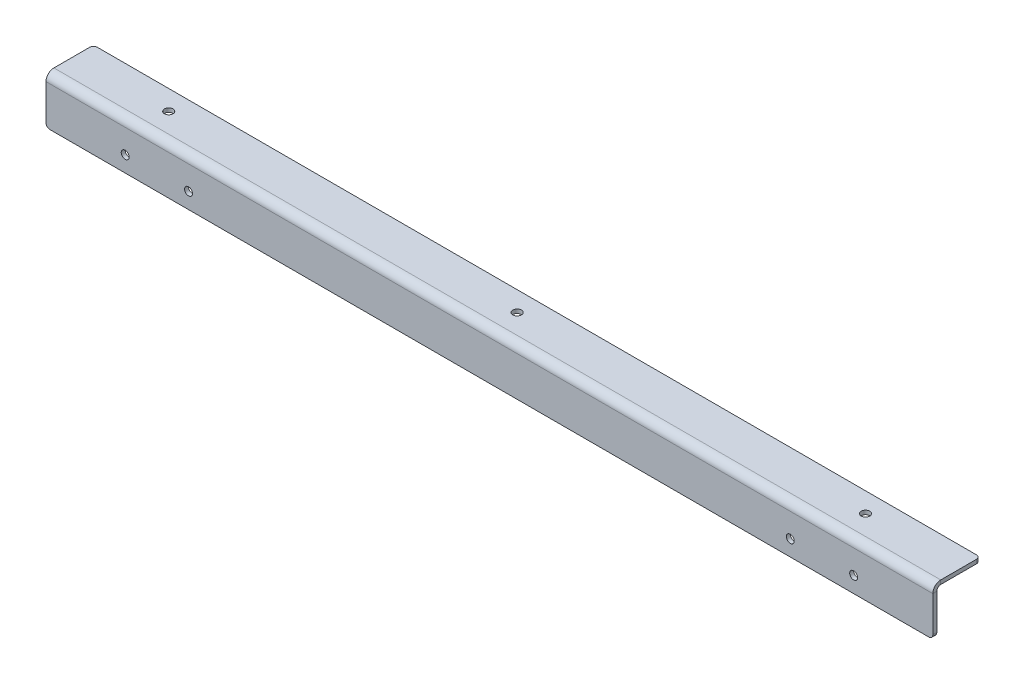
ISO-10303-21;
HEADER;
FILE_DESCRIPTION(('STEP AP214'),'2;1');
FILE_NAME('part.step','',(''),(''),'','','');
FILE_SCHEMA(('AUTOMOTIVE_DESIGN { 1 0 10303 214 1 1 1 1 }'));
ENDSEC;
DATA;
#1=APPLICATION_CONTEXT('core data for automotive mechanical design processes');
#2=APPLICATION_PROTOCOL_DEFINITION('international standard','automotive_design',2000,#1);
#3=PRODUCT_CONTEXT('',#1,'mechanical');
#4=PRODUCT('Part','Part','',(#3));
#5=PRODUCT_RELATED_PRODUCT_CATEGORY('part','',(#4));
#6=PRODUCT_DEFINITION_FORMATION('','',#4);
#7=PRODUCT_DEFINITION_CONTEXT('part definition',#1,'design');
#8=PRODUCT_DEFINITION('design','',#6,#7);
#9=PRODUCT_DEFINITION_SHAPE('','',#8);
#10=(LENGTH_UNIT() NAMED_UNIT(*) SI_UNIT(.MILLI.,.METRE.));
#11=(NAMED_UNIT(*) PLANE_ANGLE_UNIT() SI_UNIT($,.RADIAN.));
#12=(NAMED_UNIT(*) SI_UNIT($,.STERADIAN.) SOLID_ANGLE_UNIT());
#13=UNCERTAINTY_MEASURE_WITH_UNIT(LENGTH_MEASURE(1.E-05),#10,'distance_accuracy_value','');
#14=(GEOMETRIC_REPRESENTATION_CONTEXT(3) GLOBAL_UNCERTAINTY_ASSIGNED_CONTEXT((#13)) GLOBAL_UNIT_ASSIGNED_CONTEXT((#10,
#11,#12)) REPRESENTATION_CONTEXT('',''));
#15=CARTESIAN_POINT('',(0.,0.,0.));
#16=DIRECTION('',(0.,0.,1.));
#17=DIRECTION('',(1.,0.,0.));
#18=AXIS2_PLACEMENT_3D('',#15,#16,#17);
#19=CARTESIAN_POINT('',(711.2,38.1,-6.35));
#20=DIRECTION('',(1.,0.,0.));
#21=DIRECTION('',(0.,0.,-1.));
#22=AXIS2_PLACEMENT_3D('',#19,#20,#21);
#23=PLANE('',#22);
#24=DIRECTION('',(0.,-1.,0.));
#25=VECTOR('',#24,1.);
#26=CARTESIAN_POINT('',(711.2,38.1,-6.35));
#27=LINE('',#26,#25);
#28=CARTESIAN_POINT('',(711.2,38.1,-6.35));
#29=VERTEX_POINT('',#28);
#30=CARTESIAN_POINT('',(711.2,34.925,-6.35));
#31=VERTEX_POINT('',#30);
#32=EDGE_CURVE('E134',#29,#31,#27,.T.);
#33=ORIENTED_EDGE('',*,*,#32,.F.);
#34=CARTESIAN_POINT('',(711.2,31.75,-6.35));
#35=DIRECTION('',(1.,0.,0.));
#36=DIRECTION('',(0.,0.,-1.));
#37=AXIS2_PLACEMENT_3D('',#34,#35,#36);
#38=CIRCLE('',#37,6.35);
#39=CARTESIAN_POINT('',(711.2,31.75,0.));
#40=VERTEX_POINT('',#39);
#41=EDGE_CURVE('E138',#40,#29,#38,.F.);
#42=ORIENTED_EDGE('',*,*,#41,.F.);
#43=DIRECTION('',(0.,0.,1.));
#44=VECTOR('',#43,1.);
#45=CARTESIAN_POINT('',(711.2,31.75,-3.175));
#46=LINE('',#45,#44);
#47=CARTESIAN_POINT('',(711.2,31.75,-3.175));
#48=VERTEX_POINT('',#47);
#49=EDGE_CURVE('E147',#48,#40,#46,.T.);
#50=ORIENTED_EDGE('',*,*,#49,.F.);
#51=CARTESIAN_POINT('',(711.2,31.75,-6.35));
#52=DIRECTION('',(1.,0.,0.));
#53=DIRECTION('',(0.,0.,-1.));
#54=AXIS2_PLACEMENT_3D('',#51,#52,#53);
#55=CIRCLE('',#54,3.175);
#56=EDGE_CURVE('E140',#48,#31,#55,.F.);
#57=ORIENTED_EDGE('',*,*,#56,.T.);
#58=EDGE_LOOP('',(#33,#42,#50,#57));
#59=FACE_BOUND('',#58,.T.);
#60=ADVANCED_FACE('F42',(#59),#23,.T.);
#61=CARTESIAN_POINT('',(711.2,31.75,-3.175));
#62=DIRECTION('',(1.,0.,0.));
#63=DIRECTION('',(0.,0.,-1.));
#64=AXIS2_PLACEMENT_3D('',#61,#62,#63);
#65=PLANE('',#64);
#66=DIRECTION('',(0.,0.,-1.));
#67=VECTOR('',#66,1.);
#68=CARTESIAN_POINT('',(711.2,34.925,0.));
#69=LINE('',#68,#67);
#70=CARTESIAN_POINT('',(711.2,34.925,-34.925));
#71=VERTEX_POINT('',#70);
#72=EDGE_CURVE('E170',#31,#71,#69,.T.);
#73=ORIENTED_EDGE('',*,*,#72,.T.);
#74=DIRECTION('',(0.,-1.,0.));
#75=VECTOR('',#74,1.);
#76=CARTESIAN_POINT('',(711.2,31.75,-34.925));
#77=LINE('',#76,#75);
#78=CARTESIAN_POINT('',(711.2,38.1,-34.925));
#79=VERTEX_POINT('',#78);
#80=EDGE_CURVE('E168',#71,#79,#77,.F.);
#81=ORIENTED_EDGE('',*,*,#80,.T.);
#82=DIRECTION('',(0.,0.,-1.));
#83=VECTOR('',#82,1.);
#84=CARTESIAN_POINT('',(711.2,38.1,0.));
#85=LINE('',#84,#83);
#86=EDGE_CURVE('E155',#29,#79,#85,.T.);
#87=ORIENTED_EDGE('',*,*,#86,.F.);
#88=ORIENTED_EDGE('',*,*,#32,.T.);
#89=EDGE_LOOP('',(#73,#81,#87,#88));
#90=FACE_BOUND('',#89,.T.);
#91=ADVANCED_FACE('F166',(#90),#65,.T.);
#92=CARTESIAN_POINT('',(0.,31.75,0.));
#93=DIRECTION('',(-1.,0.,0.));
#94=DIRECTION('',(0.,0.,1.));
#95=AXIS2_PLACEMENT_3D('',#92,#93,#94);
#96=PLANE('',#95);
#97=DIRECTION('',(0.,0.,-1.));
#98=VECTOR('',#97,1.);
#99=CARTESIAN_POINT('',(0.,31.75,0.));
#100=LINE('',#99,#98);
#101=CARTESIAN_POINT('',(0.,31.75,0.));
#102=VERTEX_POINT('',#101);
#103=CARTESIAN_POINT('',(0.,31.75,-3.175));
#104=VERTEX_POINT('',#103);
#105=EDGE_CURVE('E235',#102,#104,#100,.T.);
#106=ORIENTED_EDGE('',*,*,#105,.F.);
#107=CARTESIAN_POINT('',(0.,31.75,-6.35));
#108=DIRECTION('',(1.,0.,0.));
#109=DIRECTION('',(0.,0.,-1.));
#110=AXIS2_PLACEMENT_3D('',#107,#108,#109);
#111=CIRCLE('',#110,6.35);
#112=CARTESIAN_POINT('',(0.,38.1,-6.35));
#113=VERTEX_POINT('',#112);
#114=EDGE_CURVE('E196',#102,#113,#111,.F.);
#115=ORIENTED_EDGE('',*,*,#114,.T.);
#116=DIRECTION('',(0.,1.,0.));
#117=VECTOR('',#116,1.);
#118=CARTESIAN_POINT('',(0.,34.925,-6.35));
#119=LINE('',#118,#117);
#120=CARTESIAN_POINT('',(0.,34.925,-6.35));
#121=VERTEX_POINT('',#120);
#122=EDGE_CURVE('E232',#121,#113,#119,.T.);
#123=ORIENTED_EDGE('',*,*,#122,.F.);
#124=CARTESIAN_POINT('',(0.,31.75,-6.35));
#125=DIRECTION('',(1.,0.,0.));
#126=DIRECTION('',(0.,0.,-1.));
#127=AXIS2_PLACEMENT_3D('',#124,#125,#126);
#128=CIRCLE('',#127,3.175);
#129=EDGE_CURVE('E205',#104,#121,#128,.F.);
#130=ORIENTED_EDGE('',*,*,#129,.F.);
#131=EDGE_LOOP('',(#106,#115,#123,#130));
#132=FACE_BOUND('',#131,.T.);
#133=ADVANCED_FACE('F300',(#132),#96,.T.);
#134=CARTESIAN_POINT('',(0.,34.925,-6.35));
#135=DIRECTION('',(-1.,0.,0.));
#136=DIRECTION('',(0.,0.,1.));
#137=AXIS2_PLACEMENT_3D('',#134,#135,#136);
#138=PLANE('',#137);
#139=DIRECTION('',(0.,1.,0.));
#140=VECTOR('',#139,1.);
#141=CARTESIAN_POINT('',(0.,0.,-3.175));
#142=LINE('',#141,#140);
#143=CARTESIAN_POINT('',(0.,3.175,-3.175));
#144=VERTEX_POINT('',#143);
#145=EDGE_CURVE('E202',#144,#104,#142,.T.);
#146=ORIENTED_EDGE('',*,*,#145,.F.);
#147=DIRECTION('',(0.,0.,1.));
#148=VECTOR('',#147,1.);
#149=CARTESIAN_POINT('',(0.,3.175,-6.35));
#150=LINE('',#149,#148);
#151=CARTESIAN_POINT('',(0.,3.175,0.));
#152=VERTEX_POINT('',#151);
#153=EDGE_CURVE('E11',#144,#152,#150,.T.);
#154=ORIENTED_EDGE('',*,*,#153,.T.);
#155=DIRECTION('',(0.,1.,0.));
#156=VECTOR('',#155,1.);
#157=CARTESIAN_POINT('',(0.,0.,0.));
#158=LINE('',#157,#156);
#159=EDGE_CURVE('E199',#152,#102,#158,.T.);
#160=ORIENTED_EDGE('',*,*,#159,.T.);
#161=ORIENTED_EDGE('',*,*,#105,.T.);
#162=EDGE_LOOP('',(#146,#154,#160,#161));
#163=FACE_BOUND('',#162,.T.);
#164=ADVANCED_FACE('F310',(#163),#138,.T.);
#165=CARTESIAN_POINT('',(711.2,34.925,0.));
#166=DIRECTION('',(0.,1.,0.));
#167=DIRECTION('',(0.,0.,1.));
#168=AXIS2_PLACEMENT_3D('',#165,#166,#167);
#169=PLANE('',#168);
#170=CARTESIAN_POINT('',(76.2,34.925,-22.225));
#171=DIRECTION('',(0.,1.,0.));
#172=DIRECTION('',(0.,0.,1.));
#173=AXIS2_PLACEMENT_3D('',#170,#171,#172);
#174=CIRCLE('',#173,3.429);
#175=CARTESIAN_POINT('',(76.2,34.925,-18.796));
#176=VERTEX_POINT('',#175);
#177=EDGE_CURVE('E193',#176,#176,#174,.T.);
#178=ORIENTED_EDGE('',*,*,#177,.T.);
#179=EDGE_LOOP('',(#178));
#180=FACE_BOUND('',#179,.T.);
#181=CARTESIAN_POINT('',(355.6,34.925,-22.225));
#182=DIRECTION('',(0.,1.,0.));
#183=DIRECTION('',(0.,0.,1.));
#184=AXIS2_PLACEMENT_3D('',#181,#182,#183);
#185=CIRCLE('',#184,3.429);
#186=CARTESIAN_POINT('',(355.6,34.925,-18.796));
#187=VERTEX_POINT('',#186);
#188=EDGE_CURVE('E440',#187,#187,#185,.T.);
#189=ORIENTED_EDGE('',*,*,#188,.T.);
#190=EDGE_LOOP('',(#189));
#191=FACE_BOUND('',#190,.T.);
#192=CARTESIAN_POINT('',(635.,34.925,-22.225));
#193=DIRECTION('',(0.,1.,0.));
#194=DIRECTION('',(0.,0.,1.));
#195=AXIS2_PLACEMENT_3D('',#192,#193,#194);
#196=CIRCLE('',#195,3.429);
#197=CARTESIAN_POINT('',(635.,34.925,-18.796));
#198=VERTEX_POINT('',#197);
#199=EDGE_CURVE('E448',#198,#198,#196,.T.);
#200=ORIENTED_EDGE('',*,*,#199,.T.);
#201=EDGE_LOOP('',(#200));
#202=FACE_BOUND('',#201,.T.);
#203=DIRECTION('',(-1.,0.,0.));
#204=VECTOR('',#203,1.);
#205=CARTESIAN_POINT('',(711.2,34.925,-38.1));
#206=LINE('',#205,#204);
#207=CARTESIAN_POINT('',(708.025,34.925,-38.1));
#208=VERTEX_POINT('',#207);
#209=CARTESIAN_POINT('',(3.17500000000004,34.925,-38.1));
#210=VERTEX_POINT('',#209);
#211=EDGE_CURVE('E228',#208,#210,#206,.T.);
#212=ORIENTED_EDGE('',*,*,#211,.F.);
#213=CARTESIAN_POINT('',(708.025,34.925,-34.925));
#214=DIRECTION('',(0.,1.,0.));
#215=DIRECTION('',(0.,0.,1.));
#216=AXIS2_PLACEMENT_3D('',#213,#214,#215);
#217=CIRCLE('',#216,3.175);
#218=EDGE_CURVE('E251',#208,#71,#217,.F.);
#219=ORIENTED_EDGE('',*,*,#218,.T.);
#220=ORIENTED_EDGE('',*,*,#72,.F.);
#221=DIRECTION('',(-1.,0.,0.));
#222=VECTOR('',#221,1.);
#223=CARTESIAN_POINT('',(711.2,34.925,-6.35));
#224=LINE('',#223,#222);
#225=EDGE_CURVE('E188',#31,#121,#224,.T.);
#226=ORIENTED_EDGE('',*,*,#225,.T.);
#227=DIRECTION('',(0.,0.,-1.));
#228=VECTOR('',#227,1.);
#229=CARTESIAN_POINT('',(0.,34.925,0.));
#230=LINE('',#229,#228);
#231=CARTESIAN_POINT('',(0.,34.925,-34.925));
#232=VERTEX_POINT('',#231);
#233=EDGE_CURVE('E189',#121,#232,#230,.T.);
#234=ORIENTED_EDGE('',*,*,#233,.T.);
#235=CARTESIAN_POINT('',(3.175,34.925,-34.925));
#236=DIRECTION('',(0.,1.,0.));
#237=DIRECTION('',(0.,0.,1.));
#238=AXIS2_PLACEMENT_3D('',#235,#236,#237);
#239=CIRCLE('',#238,3.175);
#240=EDGE_CURVE('E248',#232,#210,#239,.F.);
#241=ORIENTED_EDGE('',*,*,#240,.T.);
#242=EDGE_LOOP('',(#212,#219,#220,#226,#234,#241));
#243=FACE_BOUND('',#242,.T.);
#244=ADVANCED_FACE('F292',(#180,#191,#202,#243),#169,.F.);
#245=CARTESIAN_POINT('',(711.2,38.1,-38.1));
#246=DIRECTION('',(0.,0.,-1.));
#247=DIRECTION('',(-1.,0.,0.));
#248=AXIS2_PLACEMENT_3D('',#245,#246,#247);
#249=PLANE('',#248);
#250=DIRECTION('',(-1.,0.,0.));
#251=VECTOR('',#250,1.);
#252=CARTESIAN_POINT('',(711.2,38.1,-38.1));
#253=LINE('',#252,#251);
#254=CARTESIAN_POINT('',(708.025,38.1,-38.1));
#255=VERTEX_POINT('',#254);
#256=CARTESIAN_POINT('',(3.17500000000004,38.1,-38.1));
#257=VERTEX_POINT('',#256);
#258=EDGE_CURVE('E163',#255,#257,#253,.T.);
#259=ORIENTED_EDGE('',*,*,#258,.F.);
#260=DIRECTION('',(0.,-1.,0.));
#261=VECTOR('',#260,1.);
#262=CARTESIAN_POINT('',(708.025,38.1,-38.1));
#263=LINE('',#262,#261);
#264=EDGE_CURVE('E244',#255,#208,#263,.T.);
#265=ORIENTED_EDGE('',*,*,#264,.T.);
#266=ORIENTED_EDGE('',*,*,#211,.T.);
#267=DIRECTION('',(0.,-1.,0.));
#268=VECTOR('',#267,1.);
#269=CARTESIAN_POINT('',(3.175,38.1,-38.1));
#270=LINE('',#269,#268);
#271=EDGE_CURVE('E146',#210,#257,#270,.F.);
#272=ORIENTED_EDGE('',*,*,#271,.T.);
#273=EDGE_LOOP('',(#259,#265,#266,#272));
#274=FACE_BOUND('',#273,.T.);
#275=ADVANCED_FACE('F343',(#274),#249,.T.);
#276=CARTESIAN_POINT('',(711.2,38.1,0.));
#277=DIRECTION('',(0.,1.,0.));
#278=DIRECTION('',(0.,0.,1.));
#279=AXIS2_PLACEMENT_3D('',#276,#277,#278);
#280=PLANE('',#279);
#281=CARTESIAN_POINT('',(76.2,38.1,-22.225));
#282=DIRECTION('',(0.,1.,0.));
#283=DIRECTION('',(0.,0.,1.));
#284=AXIS2_PLACEMENT_3D('',#281,#282,#283);
#285=CIRCLE('',#284,3.429);
#286=CARTESIAN_POINT('',(76.2,38.1,-18.796));
#287=VERTEX_POINT('',#286);
#288=EDGE_CURVE('E436',#287,#287,#285,.T.);
#289=ORIENTED_EDGE('',*,*,#288,.F.);
#290=EDGE_LOOP('',(#289));
#291=FACE_BOUND('',#290,.T.);
#292=CARTESIAN_POINT('',(355.6,38.1,-22.225));
#293=DIRECTION('',(0.,1.,0.));
#294=DIRECTION('',(0.,0.,1.));
#295=AXIS2_PLACEMENT_3D('',#292,#293,#294);
#296=CIRCLE('',#295,3.429);
#297=CARTESIAN_POINT('',(355.6,38.1,-18.796));
#298=VERTEX_POINT('',#297);
#299=EDGE_CURVE('E444',#298,#298,#296,.T.);
#300=ORIENTED_EDGE('',*,*,#299,.F.);
#301=EDGE_LOOP('',(#300));
#302=FACE_BOUND('',#301,.T.);
#303=CARTESIAN_POINT('',(635.,38.1,-22.225));
#304=DIRECTION('',(0.,1.,0.));
#305=DIRECTION('',(0.,0.,1.));
#306=AXIS2_PLACEMENT_3D('',#303,#304,#305);
#307=CIRCLE('',#306,3.429);
#308=CARTESIAN_POINT('',(635.,38.1,-18.796));
#309=VERTEX_POINT('',#308);
#310=EDGE_CURVE('E408',#309,#309,#307,.T.);
#311=ORIENTED_EDGE('',*,*,#310,.F.);
#312=EDGE_LOOP('',(#311));
#313=FACE_BOUND('',#312,.T.);
#314=ORIENTED_EDGE('',*,*,#86,.T.);
#315=CARTESIAN_POINT('',(708.025,38.1,-34.925));
#316=DIRECTION('',(0.,1.,0.));
#317=DIRECTION('',(0.,0.,1.));
#318=AXIS2_PLACEMENT_3D('',#315,#316,#317);
#319=CIRCLE('',#318,3.175);
#320=EDGE_CURVE('E259',#79,#255,#319,.T.);
#321=ORIENTED_EDGE('',*,*,#320,.T.);
#322=ORIENTED_EDGE('',*,*,#258,.T.);
#323=CARTESIAN_POINT('',(3.175,38.1,-34.925));
#324=DIRECTION('',(0.,1.,0.));
#325=DIRECTION('',(0.,0.,1.));
#326=AXIS2_PLACEMENT_3D('',#323,#324,#325);
#327=CIRCLE('',#326,3.175);
#328=CARTESIAN_POINT('',(0.,38.1,-34.925));
#329=VERTEX_POINT('',#328);
#330=EDGE_CURVE('E256',#257,#329,#327,.T.);
#331=ORIENTED_EDGE('',*,*,#330,.T.);
#332=DIRECTION('',(0.,0.,-1.));
#333=VECTOR('',#332,1.);
#334=CARTESIAN_POINT('',(0.,38.1,0.));
#335=LINE('',#334,#333);
#336=EDGE_CURVE('E158',#113,#329,#335,.T.);
#337=ORIENTED_EDGE('',*,*,#336,.F.);
#338=DIRECTION('',(-1.,0.,0.));
#339=VECTOR('',#338,1.);
#340=CARTESIAN_POINT('',(711.2,38.1,-6.35));
#341=LINE('',#340,#339);
#342=EDGE_CURVE('E153',#29,#113,#341,.T.);
#343=ORIENTED_EDGE('',*,*,#342,.F.);
#344=EDGE_LOOP('',(#314,#321,#322,#331,#337,#343));
#345=FACE_BOUND('',#344,.T.);
#346=ADVANCED_FACE('F154',(#291,#302,#313,#345),#280,.T.);
#347=CARTESIAN_POINT('',(711.2,31.75,-6.35));
#348=DIRECTION('',(-1.,0.,0.));
#349=DIRECTION('',(0.,0.,1.));
#350=AXIS2_PLACEMENT_3D('',#347,#348,#349);
#351=CYLINDRICAL_SURFACE('',#350,6.35);
#352=ORIENTED_EDGE('',*,*,#114,.F.);
#353=DIRECTION('',(-1.,0.,0.));
#354=VECTOR('',#353,1.);
#355=CARTESIAN_POINT('',(711.2,31.75,0.));
#356=LINE('',#355,#354);
#357=EDGE_CURVE('E164',#40,#102,#356,.T.);
#358=ORIENTED_EDGE('',*,*,#357,.F.);
#359=ORIENTED_EDGE('',*,*,#41,.T.);
#360=ORIENTED_EDGE('',*,*,#342,.T.);
#361=EDGE_LOOP('',(#352,#358,#359,#360));
#362=FACE_BOUND('',#361,.T.);
#363=ADVANCED_FACE('F173',(#362),#351,.T.);
#364=CARTESIAN_POINT('',(711.2,0.,0.));
#365=DIRECTION('',(0.,0.,1.));
#366=DIRECTION('',(1.,0.,0.));
#367=AXIS2_PLACEMENT_3D('',#364,#365,#366);
#368=PLANE('',#367);
#369=CARTESIAN_POINT('',(63.5,12.7,0.));
#370=DIRECTION('',(0.,0.,1.));
#371=DIRECTION('',(1.,0.,0.));
#372=AXIS2_PLACEMENT_3D('',#369,#370,#371);
#373=CIRCLE('',#372,3.175);
#374=CARTESIAN_POINT('',(66.675,12.7,0.));
#375=VERTEX_POINT('',#374);
#376=EDGE_CURVE('E401',#375,#375,#373,.T.);
#377=ORIENTED_EDGE('',*,*,#376,.F.);
#378=EDGE_LOOP('',(#377));
#379=FACE_BOUND('',#378,.T.);
#380=CARTESIAN_POINT('',(114.3,12.7,0.));
#381=DIRECTION('',(0.,0.,1.));
#382=DIRECTION('',(1.,0.,0.));
#383=AXIS2_PLACEMENT_3D('',#380,#381,#382);
#384=CIRCLE('',#383,3.175);
#385=CARTESIAN_POINT('',(117.475,12.7,0.));
#386=VERTEX_POINT('',#385);
#387=EDGE_CURVE('E411',#386,#386,#384,.T.);
#388=ORIENTED_EDGE('',*,*,#387,.F.);
#389=EDGE_LOOP('',(#388));
#390=FACE_BOUND('',#389,.T.);
#391=CARTESIAN_POINT('',(596.9,12.7,0.));
#392=DIRECTION('',(0.,0.,1.));
#393=DIRECTION('',(1.,0.,0.));
#394=AXIS2_PLACEMENT_3D('',#391,#392,#393);
#395=CIRCLE('',#394,3.17500000000008);
#396=CARTESIAN_POINT('',(600.075,12.7,0.));
#397=VERTEX_POINT('',#396);
#398=EDGE_CURVE('E421',#397,#397,#395,.T.);
#399=ORIENTED_EDGE('',*,*,#398,.F.);
#400=EDGE_LOOP('',(#399));
#401=FACE_BOUND('',#400,.T.);
#402=CARTESIAN_POINT('',(647.7,12.7,0.));
#403=DIRECTION('',(0.,0.,1.));
#404=DIRECTION('',(1.,0.,0.));
#405=AXIS2_PLACEMENT_3D('',#402,#403,#404);
#406=CIRCLE('',#405,3.17500000000008);
#407=CARTESIAN_POINT('',(650.875,12.7,0.));
#408=VERTEX_POINT('',#407);
#409=EDGE_CURVE('E429',#408,#408,#406,.T.);
#410=ORIENTED_EDGE('',*,*,#409,.F.);
#411=EDGE_LOOP('',(#410));
#412=FACE_BOUND('',#411,.T.);
#413=DIRECTION('',(-1.,0.,0.));
#414=VECTOR('',#413,1.);
#415=CARTESIAN_POINT('',(711.2,0.,0.));
#416=LINE('',#415,#414);
#417=CARTESIAN_POINT('',(708.025,0.,0.));
#418=VERTEX_POINT('',#417);
#419=CARTESIAN_POINT('',(3.17500000000004,0.,0.));
#420=VERTEX_POINT('',#419);
#421=EDGE_CURVE('E219',#418,#420,#416,.T.);
#422=ORIENTED_EDGE('',*,*,#421,.F.);
#423=CARTESIAN_POINT('',(708.025,3.175,0.));
#424=DIRECTION('',(0.,0.,1.));
#425=DIRECTION('',(1.,0.,0.));
#426=AXIS2_PLACEMENT_3D('',#423,#424,#425);
#427=CIRCLE('',#426,3.175);
#428=CARTESIAN_POINT('',(711.2,3.175,0.));
#429=VERTEX_POINT('',#428);
#430=EDGE_CURVE('E272',#418,#429,#427,.T.);
#431=ORIENTED_EDGE('',*,*,#430,.T.);
#432=DIRECTION('',(0.,1.,0.));
#433=VECTOR('',#432,1.);
#434=CARTESIAN_POINT('',(711.2,0.,0.));
#435=LINE('',#434,#433);
#436=EDGE_CURVE('E176',#429,#40,#435,.T.);
#437=ORIENTED_EDGE('',*,*,#436,.T.);
#438=ORIENTED_EDGE('',*,*,#357,.T.);
#439=ORIENTED_EDGE('',*,*,#159,.F.);
#440=CARTESIAN_POINT('',(3.175,3.175,0.));
#441=DIRECTION('',(0.,0.,1.));
#442=DIRECTION('',(1.,0.,0.));
#443=AXIS2_PLACEMENT_3D('',#440,#441,#442);
#444=CIRCLE('',#443,3.175);
#445=EDGE_CURVE('E269',#152,#420,#444,.T.);
#446=ORIENTED_EDGE('',*,*,#445,.T.);
#447=EDGE_LOOP('',(#422,#431,#437,#438,#439,#446));
#448=FACE_BOUND('',#447,.T.);
#449=ADVANCED_FACE('F305',(#379,#390,#401,#412,#448),#368,.T.);
#450=CARTESIAN_POINT('',(711.2,0.,-3.175));
#451=DIRECTION('',(0.,-1.,0.));
#452=DIRECTION('',(0.,0.,-1.));
#453=AXIS2_PLACEMENT_3D('',#450,#451,#452);
#454=PLANE('',#453);
#455=DIRECTION('',(-1.,0.,0.));
#456=VECTOR('',#455,1.);
#457=CARTESIAN_POINT('',(711.2,0.,-3.175));
#458=LINE('',#457,#456);
#459=CARTESIAN_POINT('',(708.025,0.,-3.175));
#460=VERTEX_POINT('',#459);
#461=CARTESIAN_POINT('',(3.17500000000004,0.,-3.175));
#462=VERTEX_POINT('',#461);
#463=EDGE_CURVE('E216',#460,#462,#458,.T.);
#464=ORIENTED_EDGE('',*,*,#463,.F.);
#465=DIRECTION('',(0.,0.,1.));
#466=VECTOR('',#465,1.);
#467=CARTESIAN_POINT('',(708.025,0.,-3.175));
#468=LINE('',#467,#466);
#469=EDGE_CURVE('E265',#460,#418,#468,.T.);
#470=ORIENTED_EDGE('',*,*,#469,.T.);
#471=ORIENTED_EDGE('',*,*,#421,.T.);
#472=DIRECTION('',(0.,0.,1.));
#473=VECTOR('',#472,1.);
#474=CARTESIAN_POINT('',(3.17500000000004,0.,-3.175));
#475=LINE('',#474,#473);
#476=EDGE_CURVE('E262',#420,#462,#475,.F.);
#477=ORIENTED_EDGE('',*,*,#476,.T.);
#478=EDGE_LOOP('',(#464,#470,#471,#477));
#479=FACE_BOUND('',#478,.T.);
#480=ADVANCED_FACE('F315',(#479),#454,.T.);
#481=CARTESIAN_POINT('',(711.2,0.,-3.175));
#482=DIRECTION('',(0.,0.,1.));
#483=DIRECTION('',(1.,0.,0.));
#484=AXIS2_PLACEMENT_3D('',#481,#482,#483);
#485=PLANE('',#484);
#486=CARTESIAN_POINT('',(63.5,12.7,-3.175));
#487=DIRECTION('',(0.,0.,1.));
#488=DIRECTION('',(1.,0.,0.));
#489=AXIS2_PLACEMENT_3D('',#486,#487,#488);
#490=CIRCLE('',#489,3.175);
#491=CARTESIAN_POINT('',(66.675,12.7,-3.175));
#492=VERTEX_POINT('',#491);
#493=EDGE_CURVE('E398',#492,#492,#490,.T.);
#494=ORIENTED_EDGE('',*,*,#493,.T.);
#495=EDGE_LOOP('',(#494));
#496=FACE_BOUND('',#495,.T.);
#497=CARTESIAN_POINT('',(114.3,12.7,-3.175));
#498=DIRECTION('',(0.,0.,1.));
#499=DIRECTION('',(1.,0.,0.));
#500=AXIS2_PLACEMENT_3D('',#497,#498,#499);
#501=CIRCLE('',#500,3.175);
#502=CARTESIAN_POINT('',(117.475,12.7,-3.175));
#503=VERTEX_POINT('',#502);
#504=EDGE_CURVE('E403',#503,#503,#501,.T.);
#505=ORIENTED_EDGE('',*,*,#504,.T.);
#506=EDGE_LOOP('',(#505));
#507=FACE_BOUND('',#506,.T.);
#508=CARTESIAN_POINT('',(596.9,12.7,-3.175));
#509=DIRECTION('',(0.,0.,1.));
#510=DIRECTION('',(1.,0.,0.));
#511=AXIS2_PLACEMENT_3D('',#508,#509,#510);
#512=CIRCLE('',#511,3.17500000000008);
#513=CARTESIAN_POINT('',(600.075,12.7,-3.175));
#514=VERTEX_POINT('',#513);
#515=EDGE_CURVE('E417',#514,#514,#512,.T.);
#516=ORIENTED_EDGE('',*,*,#515,.T.);
#517=EDGE_LOOP('',(#516));
#518=FACE_BOUND('',#517,.T.);
#519=CARTESIAN_POINT('',(647.7,12.7,-3.175));
#520=DIRECTION('',(0.,0.,1.));
#521=DIRECTION('',(1.,0.,0.));
#522=AXIS2_PLACEMENT_3D('',#519,#520,#521);
#523=CIRCLE('',#522,3.17500000000008);
#524=CARTESIAN_POINT('',(650.875,12.7,-3.175));
#525=VERTEX_POINT('',#524);
#526=EDGE_CURVE('E425',#525,#525,#523,.T.);
#527=ORIENTED_EDGE('',*,*,#526,.T.);
#528=EDGE_LOOP('',(#527));
#529=FACE_BOUND('',#528,.T.);
#530=DIRECTION('',(0.,1.,0.));
#531=VECTOR('',#530,1.);
#532=CARTESIAN_POINT('',(711.2,0.,-3.175));
#533=LINE('',#532,#531);
#534=CARTESIAN_POINT('',(711.2,3.175,-3.175));
#535=VERTEX_POINT('',#534);
#536=EDGE_CURVE('E180',#535,#48,#533,.T.);
#537=ORIENTED_EDGE('',*,*,#536,.F.);
#538=CARTESIAN_POINT('',(708.025,3.175,-3.175));
#539=DIRECTION('',(0.,0.,1.));
#540=DIRECTION('',(1.,0.,0.));
#541=AXIS2_PLACEMENT_3D('',#538,#539,#540);
#542=CIRCLE('',#541,3.175);
#543=EDGE_CURVE('E279',#535,#460,#542,.F.);
#544=ORIENTED_EDGE('',*,*,#543,.T.);
#545=ORIENTED_EDGE('',*,*,#463,.T.);
#546=CARTESIAN_POINT('',(3.175,3.175,-3.175));
#547=DIRECTION('',(0.,0.,1.));
#548=DIRECTION('',(1.,0.,0.));
#549=AXIS2_PLACEMENT_3D('',#546,#547,#548);
#550=CIRCLE('',#549,3.175);
#551=EDGE_CURVE('E58',#462,#144,#550,.F.);
#552=ORIENTED_EDGE('',*,*,#551,.T.);
#553=ORIENTED_EDGE('',*,*,#145,.T.);
#554=DIRECTION('',(-1.,0.,0.));
#555=VECTOR('',#554,1.);
#556=CARTESIAN_POINT('',(711.2,31.75,-3.175));
#557=LINE('',#556,#555);
#558=EDGE_CURVE('E212',#48,#104,#557,.T.);
#559=ORIENTED_EDGE('',*,*,#558,.F.);
#560=EDGE_LOOP('',(#537,#544,#545,#552,#553,#559));
#561=FACE_BOUND('',#560,.T.);
#562=ADVANCED_FACE('F307',(#496,#507,#518,#529,#561),#485,.F.);
#563=CARTESIAN_POINT('',(711.2,31.75,-6.35));
#564=DIRECTION('',(-1.,0.,0.));
#565=DIRECTION('',(0.,0.,1.));
#566=AXIS2_PLACEMENT_3D('',#563,#564,#565);
#567=CYLINDRICAL_SURFACE('',#566,3.175);
#568=ORIENTED_EDGE('',*,*,#129,.T.);
#569=ORIENTED_EDGE('',*,*,#225,.F.);
#570=ORIENTED_EDGE('',*,*,#56,.F.);
#571=ORIENTED_EDGE('',*,*,#558,.T.);
#572=EDGE_LOOP('',(#568,#569,#570,#571));
#573=FACE_BOUND('',#572,.T.);
#574=ADVANCED_FACE('F295',(#573),#567,.F.);
#575=CARTESIAN_POINT('',(711.2,31.75,-6.35));
#576=DIRECTION('',(1.,0.,0.));
#577=DIRECTION('',(0.,0.,-1.));
#578=AXIS2_PLACEMENT_3D('',#575,#576,#577);
#579=PLANE('',#578);
#580=ORIENTED_EDGE('',*,*,#436,.F.);
#581=DIRECTION('',(0.,0.,1.));
#582=VECTOR('',#581,1.);
#583=CARTESIAN_POINT('',(711.2,3.175,-6.35));
#584=LINE('',#583,#582);
#585=EDGE_CURVE('E66',#429,#535,#584,.F.);
#586=ORIENTED_EDGE('',*,*,#585,.T.);
#587=ORIENTED_EDGE('',*,*,#536,.T.);
#588=ORIENTED_EDGE('',*,*,#49,.T.);
#589=EDGE_LOOP('',(#580,#586,#587,#588));
#590=FACE_BOUND('',#589,.T.);
#591=ADVANCED_FACE('F306',(#590),#579,.T.);
#592=CARTESIAN_POINT('',(0.,31.75,-6.35));
#593=DIRECTION('',(1.,0.,0.));
#594=DIRECTION('',(0.,0.,-1.));
#595=AXIS2_PLACEMENT_3D('',#592,#593,#594);
#596=PLANE('',#595);
#597=ORIENTED_EDGE('',*,*,#336,.T.);
#598=DIRECTION('',(0.,-1.,0.));
#599=VECTOR('',#598,1.);
#600=CARTESIAN_POINT('',(0.,34.925,-34.925));
#601=LINE('',#600,#599);
#602=EDGE_CURVE('E51',#329,#232,#601,.T.);
#603=ORIENTED_EDGE('',*,*,#602,.T.);
#604=ORIENTED_EDGE('',*,*,#233,.F.);
#605=ORIENTED_EDGE('',*,*,#122,.T.);
#606=EDGE_LOOP('',(#597,#603,#604,#605));
#607=FACE_BOUND('',#606,.T.);
#608=ADVANCED_FACE('F287',(#607),#596,.F.);
#609=CARTESIAN_POINT('',(635.,34.925,-22.225));
#610=DIRECTION('',(0.,1.,0.));
#611=DIRECTION('',(0.,0.,1.));
#612=AXIS2_PLACEMENT_3D('',#609,#610,#611);
#613=CYLINDRICAL_SURFACE('',#612,3.429);
#614=ORIENTED_EDGE('',*,*,#199,.F.);
#615=EDGE_LOOP('',(#614));
#616=FACE_BOUND('',#615,.T.);
#617=ORIENTED_EDGE('',*,*,#310,.T.);
#618=EDGE_LOOP('',(#617));
#619=FACE_BOUND('',#618,.T.);
#620=ADVANCED_FACE('F365',(#616,#619),#613,.F.);
#621=CARTESIAN_POINT('',(355.6,34.925,-22.225));
#622=DIRECTION('',(0.,1.,0.));
#623=DIRECTION('',(0.,0.,1.));
#624=AXIS2_PLACEMENT_3D('',#621,#622,#623);
#625=CYLINDRICAL_SURFACE('',#624,3.429);
#626=ORIENTED_EDGE('',*,*,#188,.F.);
#627=EDGE_LOOP('',(#626));
#628=FACE_BOUND('',#627,.T.);
#629=ORIENTED_EDGE('',*,*,#299,.T.);
#630=EDGE_LOOP('',(#629));
#631=FACE_BOUND('',#630,.T.);
#632=ADVANCED_FACE('F370',(#628,#631),#625,.F.);
#633=CARTESIAN_POINT('',(76.2,34.925,-22.225));
#634=DIRECTION('',(0.,1.,0.));
#635=DIRECTION('',(0.,0.,1.));
#636=AXIS2_PLACEMENT_3D('',#633,#634,#635);
#637=CYLINDRICAL_SURFACE('',#636,3.429);
#638=ORIENTED_EDGE('',*,*,#177,.F.);
#639=EDGE_LOOP('',(#638));
#640=FACE_BOUND('',#639,.T.);
#641=ORIENTED_EDGE('',*,*,#288,.T.);
#642=EDGE_LOOP('',(#641));
#643=FACE_BOUND('',#642,.T.);
#644=ADVANCED_FACE('F327',(#640,#643),#637,.F.);
#645=CARTESIAN_POINT('',(708.025,38.1,-34.925));
#646=DIRECTION('',(0.,-1.,0.));
#647=DIRECTION('',(0.,0.,-1.));
#648=AXIS2_PLACEMENT_3D('',#645,#646,#647);
#649=CYLINDRICAL_SURFACE('',#648,3.175);
#650=ORIENTED_EDGE('',*,*,#320,.F.);
#651=ORIENTED_EDGE('',*,*,#80,.F.);
#652=ORIENTED_EDGE('',*,*,#218,.F.);
#653=ORIENTED_EDGE('',*,*,#264,.F.);
#654=EDGE_LOOP('',(#650,#651,#652,#653));
#655=FACE_BOUND('',#654,.T.);
#656=ADVANCED_FACE('F321',(#655),#649,.T.);
#657=CARTESIAN_POINT('',(708.025,3.175,-3.175));
#658=DIRECTION('',(0.,0.,1.));
#659=DIRECTION('',(1.,0.,0.));
#660=AXIS2_PLACEMENT_3D('',#657,#658,#659);
#661=CYLINDRICAL_SURFACE('',#660,3.175);
#662=ORIENTED_EDGE('',*,*,#543,.F.);
#663=ORIENTED_EDGE('',*,*,#585,.F.);
#664=ORIENTED_EDGE('',*,*,#430,.F.);
#665=ORIENTED_EDGE('',*,*,#469,.F.);
#666=EDGE_LOOP('',(#662,#663,#664,#665));
#667=FACE_BOUND('',#666,.T.);
#668=ADVANCED_FACE('F318',(#667),#661,.T.);
#669=CARTESIAN_POINT('',(3.175,31.75,-34.925));
#670=DIRECTION('',(0.,1.,0.));
#671=DIRECTION('',(0.,0.,1.));
#672=AXIS2_PLACEMENT_3D('',#669,#670,#671);
#673=CYLINDRICAL_SURFACE('',#672,3.175);
#674=ORIENTED_EDGE('',*,*,#330,.F.);
#675=ORIENTED_EDGE('',*,*,#271,.F.);
#676=ORIENTED_EDGE('',*,*,#240,.F.);
#677=ORIENTED_EDGE('',*,*,#602,.F.);
#678=EDGE_LOOP('',(#674,#675,#676,#677));
#679=FACE_BOUND('',#678,.T.);
#680=ADVANCED_FACE('F320',(#679),#673,.T.);
#681=CARTESIAN_POINT('',(3.175,3.175,-6.35));
#682=DIRECTION('',(0.,0.,1.));
#683=DIRECTION('',(1.,0.,0.));
#684=AXIS2_PLACEMENT_3D('',#681,#682,#683);
#685=CYLINDRICAL_SURFACE('',#684,3.175);
#686=ORIENTED_EDGE('',*,*,#551,.F.);
#687=ORIENTED_EDGE('',*,*,#476,.F.);
#688=ORIENTED_EDGE('',*,*,#445,.F.);
#689=ORIENTED_EDGE('',*,*,#153,.F.);
#690=EDGE_LOOP('',(#686,#687,#688,#689));
#691=FACE_BOUND('',#690,.T.);
#692=ADVANCED_FACE('F44',(#691),#685,.T.);
#693=CARTESIAN_POINT('',(647.7,12.7,-3.175));
#694=DIRECTION('',(0.,0.,1.));
#695=DIRECTION('',(1.,0.,0.));
#696=AXIS2_PLACEMENT_3D('',#693,#694,#695);
#697=CYLINDRICAL_SURFACE('',#696,3.17500000000008);
#698=ORIENTED_EDGE('',*,*,#526,.F.);
#699=EDGE_LOOP('',(#698));
#700=FACE_BOUND('',#699,.T.);
#701=ORIENTED_EDGE('',*,*,#409,.T.);
#702=EDGE_LOOP('',(#701));
#703=FACE_BOUND('',#702,.T.);
#704=ADVANCED_FACE('F378',(#700,#703),#697,.F.);
#705=CARTESIAN_POINT('',(596.9,12.7,-3.175));
#706=DIRECTION('',(0.,0.,1.));
#707=DIRECTION('',(1.,0.,0.));
#708=AXIS2_PLACEMENT_3D('',#705,#706,#707);
#709=CYLINDRICAL_SURFACE('',#708,3.17500000000008);
#710=ORIENTED_EDGE('',*,*,#515,.F.);
#711=EDGE_LOOP('',(#710));
#712=FACE_BOUND('',#711,.T.);
#713=ORIENTED_EDGE('',*,*,#398,.T.);
#714=EDGE_LOOP('',(#713));
#715=FACE_BOUND('',#714,.T.);
#716=ADVANCED_FACE('F381',(#712,#715),#709,.F.);
#717=CARTESIAN_POINT('',(114.3,12.7,-3.175));
#718=DIRECTION('',(0.,0.,1.));
#719=DIRECTION('',(1.,0.,0.));
#720=AXIS2_PLACEMENT_3D('',#717,#718,#719);
#721=CYLINDRICAL_SURFACE('',#720,3.175);
#722=ORIENTED_EDGE('',*,*,#504,.F.);
#723=EDGE_LOOP('',(#722));
#724=FACE_BOUND('',#723,.T.);
#725=ORIENTED_EDGE('',*,*,#387,.T.);
#726=EDGE_LOOP('',(#725));
#727=FACE_BOUND('',#726,.T.);
#728=ADVANCED_FACE('F385',(#724,#727),#721,.F.);
#729=CARTESIAN_POINT('',(63.5,12.7,-3.175));
#730=DIRECTION('',(0.,0.,1.));
#731=DIRECTION('',(1.,0.,0.));
#732=AXIS2_PLACEMENT_3D('',#729,#730,#731);
#733=CYLINDRICAL_SURFACE('',#732,3.175);
#734=ORIENTED_EDGE('',*,*,#493,.F.);
#735=EDGE_LOOP('',(#734));
#736=FACE_BOUND('',#735,.T.);
#737=ORIENTED_EDGE('',*,*,#376,.T.);
#738=EDGE_LOOP('',(#737));
#739=FACE_BOUND('',#738,.T.);
#740=ADVANCED_FACE('F389',(#736,#739),#733,.F.);
#741=CLOSED_SHELL('',(#60,#91,#133,#164,#244,#275,#346,#363,#449,#480,#562,#574,#591,#608,#620,
#632,#644,#656,#668,#680,#692,#704,#716,#728,#740));
#742=MANIFOLD_SOLID_BREP('B2',#741);
#743=ADVANCED_BREP_SHAPE_REPRESENTATION('',(#18,#742),#14);
#744=SHAPE_DEFINITION_REPRESENTATION(#9,#743);
ENDSEC;
END-ISO-10303-21;
